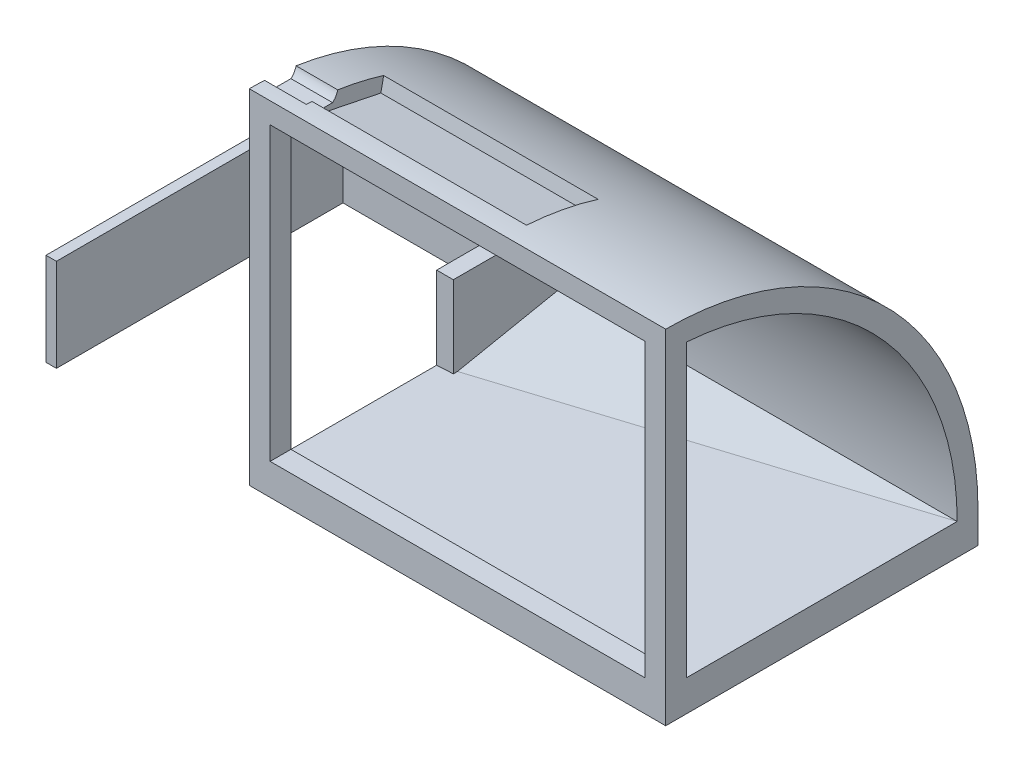
ISO-10303-21;
HEADER;
FILE_DESCRIPTION(('STEP AP214'),'2;1');
FILE_NAME('part.step','',(''),(''),'','','');
FILE_SCHEMA(('AUTOMOTIVE_DESIGN { 1 0 10303 214 1 1 1 1 }'));
ENDSEC;
DATA;
#1=APPLICATION_CONTEXT('core data for automotive mechanical design processes');
#2=APPLICATION_PROTOCOL_DEFINITION('international standard','automotive_design',2000,#1);
#3=PRODUCT_CONTEXT('',#1,'mechanical');
#4=PRODUCT('Part','Part','',(#3));
#5=PRODUCT_RELATED_PRODUCT_CATEGORY('part','',(#4));
#6=PRODUCT_DEFINITION_FORMATION('','',#4);
#7=PRODUCT_DEFINITION_CONTEXT('part definition',#1,'design');
#8=PRODUCT_DEFINITION('design','',#6,#7);
#9=PRODUCT_DEFINITION_SHAPE('','',#8);
#10=(LENGTH_UNIT() NAMED_UNIT(*) SI_UNIT(.MILLI.,.METRE.));
#11=(NAMED_UNIT(*) PLANE_ANGLE_UNIT() SI_UNIT($,.RADIAN.));
#12=(NAMED_UNIT(*) SI_UNIT($,.STERADIAN.) SOLID_ANGLE_UNIT());
#13=UNCERTAINTY_MEASURE_WITH_UNIT(LENGTH_MEASURE(1.E-05),#10,'distance_accuracy_value','');
#14=(GEOMETRIC_REPRESENTATION_CONTEXT(3) GLOBAL_UNCERTAINTY_ASSIGNED_CONTEXT((#13)) GLOBAL_UNIT_ASSIGNED_CONTEXT((#10,
#11,#12)) REPRESENTATION_CONTEXT('',''));
#15=CARTESIAN_POINT('',(0.,0.,0.));
#16=DIRECTION('',(0.,0.,1.));
#17=DIRECTION('',(1.,0.,0.));
#18=AXIS2_PLACEMENT_3D('',#15,#16,#17);
#19=CARTESIAN_POINT('',(-100.,0.,75.));
#20=DIRECTION('',(-1.,0.,0.));
#21=DIRECTION('',(0.,0.,1.));
#22=AXIS2_PLACEMENT_3D('',#19,#20,#21);
#23=CYLINDRICAL_SURFACE('',#22,140.);
#24=CARTESIAN_POINT('',(-195.,0.,75.));
#25=DIRECTION('',(-1.,0.,0.));
#26=DIRECTION('',(0.,0.,1.));
#27=AXIS2_PLACEMENT_3D('',#24,#25,#26);
#28=CIRCLE('',#27,140.);
#29=CARTESIAN_POINT('',(-195.,29.5585297831051,-61.8440474301359));
#30=VERTEX_POINT('',#29);
#31=CARTESIAN_POINT('',(-195.,0.,-65.));
#32=VERTEX_POINT('',#31);
#33=EDGE_CURVE('E434',#30,#32,#28,.T.);
#34=ORIENTED_EDGE('',*,*,#33,.T.);
#35=DIRECTION('',(1.,0.,0.));
#36=VECTOR('',#35,1.);
#37=CARTESIAN_POINT('',(-200.,0.,-65.));
#38=LINE('',#37,#36);
#39=CARTESIAN_POINT('',(-100.,0.,-65.));
#40=VERTEX_POINT('',#39);
#41=EDGE_CURVE('E215',#32,#40,#38,.T.);
#42=ORIENTED_EDGE('',*,*,#41,.T.);
#43=CARTESIAN_POINT('',(-100.,0.,75.));
#44=DIRECTION('',(-1.,0.,0.));
#45=DIRECTION('',(0.,0.,1.));
#46=AXIS2_PLACEMENT_3D('',#43,#44,#45);
#47=CIRCLE('',#46,140.);
#48=CARTESIAN_POINT('',(-100.,29.5585297831051,-61.8440474301359));
#49=VERTEX_POINT('',#48);
#50=EDGE_CURVE('E466',#49,#40,#47,.T.);
#51=ORIENTED_EDGE('',*,*,#50,.F.);
#52=DIRECTION('',(1.,0.,0.));
#53=VECTOR('',#52,1.);
#54=CARTESIAN_POINT('',(-200.,29.5585297831051,-61.8440474301359));
#55=LINE('',#54,#53);
#56=EDGE_CURVE('E230',#30,#49,#55,.T.);
#57=ORIENTED_EDGE('',*,*,#56,.F.);
#58=EDGE_LOOP('',(#34,#42,#51,#57));
#59=FACE_BOUND('',#58,.T.);
#60=ADVANCED_FACE('F211',(#59),#23,.F.);
#61=CARTESIAN_POINT('',(-200.,0.,-65.));
#62=DIRECTION('',(0.,0.,1.));
#63=DIRECTION('',(1.,0.,0.));
#64=AXIS2_PLACEMENT_3D('',#61,#62,#63);
#65=PLANE('',#64);
#66=ORIENTED_EDGE('',*,*,#41,.F.);
#67=DIRECTION('',(0.,-1.,0.));
#68=VECTOR('',#67,1.);
#69=CARTESIAN_POINT('',(-195.,0.,-65.));
#70=LINE('',#69,#68);
#71=CARTESIAN_POINT('',(-195.,-15.,-65.));
#72=VERTEX_POINT('',#71);
#73=EDGE_CURVE('E238',#32,#72,#70,.T.);
#74=ORIENTED_EDGE('',*,*,#73,.T.);
#75=DIRECTION('',(1.,0.,0.));
#76=VECTOR('',#75,1.);
#77=CARTESIAN_POINT('',(-200.,-15.,-65.));
#78=LINE('',#77,#76);
#79=CARTESIAN_POINT('',(-100.,-15.,-65.));
#80=VERTEX_POINT('',#79);
#81=EDGE_CURVE('E430',#72,#80,#78,.T.);
#82=ORIENTED_EDGE('',*,*,#81,.T.);
#83=DIRECTION('',(0.,-1.,0.));
#84=VECTOR('',#83,1.);
#85=CARTESIAN_POINT('',(-100.,0.,-65.));
#86=LINE('',#85,#84);
#87=EDGE_CURVE('E474',#40,#80,#86,.T.);
#88=ORIENTED_EDGE('',*,*,#87,.F.);
#89=EDGE_LOOP('',(#66,#74,#82,#88));
#90=FACE_BOUND('',#89,.T.);
#91=ADVANCED_FACE('F553',(#90),#65,.T.);
#92=CARTESIAN_POINT('',(-92.,0.,75.));
#93=DIRECTION('',(-1.,0.,0.));
#94=DIRECTION('',(0.,0.,1.));
#95=AXIS2_PLACEMENT_3D('',#92,#93,#94);
#96=CIRCLE('',#95,140.);
#97=CARTESIAN_POINT('',(-92.,29.5585297831051,-61.8440474301359));
#98=VERTEX_POINT('',#97);
#99=CARTESIAN_POINT('',(-92.,0.,-65.));
#100=VERTEX_POINT('',#99);
#101=EDGE_CURVE('E449',#98,#100,#96,.T.);
#102=ORIENTED_EDGE('',*,*,#101,.T.);
#103=CARTESIAN_POINT('',(-92.,0.,-65.));
#104=DIRECTION('',(1.,0.,0.));
#105=VECTOR('',#104,1.);
#106=LINE('',#103,#105);
#107=CARTESIAN_POINT('',(100.,0.,-65.));
#108=VERTEX_POINT('',#107);
#109=EDGE_CURVE('E576',#100,#108,#106,.T.);
#110=ORIENTED_EDGE('',*,*,#109,.T.);
#111=CARTESIAN_POINT('',(100.,0.,75.));
#112=DIRECTION('',(-1.,0.,0.));
#113=DIRECTION('',(0.,0.,1.));
#114=AXIS2_PLACEMENT_3D('',#111,#112,#113);
#115=CIRCLE('',#114,140.);
#116=CARTESIAN_POINT('',(100.,139.642400437689,65.));
#117=VERTEX_POINT('',#116);
#118=EDGE_CURVE('E723',#117,#108,#115,.T.);
#119=ORIENTED_EDGE('',*,*,#118,.F.);
#120=DIRECTION('',(-1.,0.,0.));
#121=VECTOR('',#120,1.);
#122=CARTESIAN_POINT('',(-100.,139.642400437689,65.));
#123=LINE('',#122,#121);
#124=CARTESIAN_POINT('',(90.,139.642400437689,65.));
#125=VERTEX_POINT('',#124);
#126=EDGE_CURVE('E682',#117,#125,#123,.T.);
#127=ORIENTED_EDGE('',*,*,#126,.T.);
#128=CARTESIAN_POINT('',(90.,0.,75.));
#129=DIRECTION('',(-1.,0.,0.));
#130=DIRECTION('',(0.,0.,1.));
#131=AXIS2_PLACEMENT_3D('',#128,#129,#130);
#132=CIRCLE('',#131,140.);
#133=CARTESIAN_POINT('',(90.,140.,75.0000000000005));
#134=VERTEX_POINT('',#133);
#135=EDGE_CURVE('E679',#134,#125,#132,.T.);
#136=ORIENTED_EDGE('',*,*,#135,.F.);
#137=DIRECTION('',(1.,0.,0.));
#138=VECTOR('',#137,1.);
#139=CARTESIAN_POINT('',(0.,140.,75.0000000000005));
#140=LINE('',#139,#138);
#141=CARTESIAN_POINT('',(-90.,140.,75.0000000000005));
#142=VERTEX_POINT('',#141);
#143=EDGE_CURVE('E705',#142,#134,#140,.T.);
#144=ORIENTED_EDGE('',*,*,#143,.F.);
#145=CARTESIAN_POINT('',(-90.,0.,75.));
#146=DIRECTION('',(-1.,0.,0.));
#147=DIRECTION('',(0.,0.,1.));
#148=AXIS2_PLACEMENT_3D('',#145,#146,#147);
#149=CIRCLE('',#148,140.);
#150=CARTESIAN_POINT('',(-90.,139.642400437689,65.0000000000001));
#151=VERTEX_POINT('',#150);
#152=EDGE_CURVE('E696',#142,#151,#149,.T.);
#153=ORIENTED_EDGE('',*,*,#152,.T.);
#154=DIRECTION('',(-1.,0.,0.));
#155=VECTOR('',#154,1.);
#156=CARTESIAN_POINT('',(-100.,139.642400437689,65.0000000000001));
#157=LINE('',#156,#155);
#158=CARTESIAN_POINT('',(-100.,139.642400437689,65.0000000000001));
#159=VERTEX_POINT('',#158);
#160=EDGE_CURVE('E701',#159,#151,#157,.F.);
#161=ORIENTED_EDGE('',*,*,#160,.F.);
#162=CARTESIAN_POINT('',(-100.,0.,75.));
#163=DIRECTION('',(-1.,0.,0.));
#164=DIRECTION('',(0.,0.,1.));
#165=AXIS2_PLACEMENT_3D('',#162,#163,#164);
#166=CIRCLE('',#165,140.);
#167=EDGE_CURVE('E713',#159,#49,#166,.T.);
#168=ORIENTED_EDGE('',*,*,#167,.T.);
#169=DIRECTION('',(-1.,0.,0.));
#170=VECTOR('',#169,1.);
#171=CARTESIAN_POINT('',(-92.,29.5585297831051,-61.8440474301359));
#172=LINE('',#171,#170);
#173=EDGE_CURVE('E461',#98,#49,#172,.T.);
#174=ORIENTED_EDGE('',*,*,#173,.F.);
#175=EDGE_LOOP('',(#102,#110,#119,#127,#136,#144,#153,#161,#168,#174));
#176=FACE_BOUND('',#175,.T.);
#177=ADVANCED_FACE('F554',(#176),#23,.F.);
#178=CARTESIAN_POINT('',(-100.,0.,-65.));
#179=DIRECTION('',(0.,-0.98058067569092,-0.196116135138184));
#180=DIRECTION('',(1.,0.,0.));
#181=AXIS2_PLACEMENT_3D('',#178,#179,#180);
#182=PLANE('',#181);
#183=DIRECTION('',(0.,-0.196116135138184,0.98058067569092));
#184=VECTOR('',#183,1.);
#185=CARTESIAN_POINT('',(-92.,-12.5,-2.49999999999998));
#186=LINE('',#185,#184);
#187=CARTESIAN_POINT('',(-92.,-9.60000000000001,-16.9999999999999));
#188=VERTEX_POINT('',#187);
#189=EDGE_CURVE('E456',#100,#188,#186,.T.);
#190=ORIENTED_EDGE('',*,*,#189,.T.);
#191=DIRECTION('',(-0.969003166223018,-0.048450158311151,0.242250791555755));
#192=VECTOR('',#191,1.);
#193=CARTESIAN_POINT('',(0.,-5.,-40.));
#194=LINE('',#193,#192);
#195=EDGE_CURVE('E509',#108,#188,#194,.T.);
#196=ORIENTED_EDGE('',*,*,#195,.F.);
#197=ORIENTED_EDGE('',*,*,#109,.F.);
#198=EDGE_LOOP('',(#190,#196,#197));
#199=FACE_BOUND('',#198,.T.);
#200=ADVANCED_FACE('F594',(#199),#182,.F.);
#201=CARTESIAN_POINT('',(-100.,0.,75.));
#202=DIRECTION('',(-1.,0.,0.));
#203=DIRECTION('',(0.,0.,1.));
#204=AXIS2_PLACEMENT_3D('',#201,#202,#203);
#205=CYLINDRICAL_SURFACE('',#204,150.);
#206=DIRECTION('',(-1.,0.,0.));
#207=VECTOR('',#206,1.);
#208=CARTESIAN_POINT('',(-90.,148.308101078321,52.5343116165472));
#209=LINE('',#208,#207);
#210=CARTESIAN_POINT('',(-80.,148.308101078321,52.5343116165472));
#211=VERTEX_POINT('',#210);
#212=CARTESIAN_POINT('',(-100.,148.308101078321,52.5343116165472));
#213=VERTEX_POINT('',#212);
#214=EDGE_CURVE('E662',#211,#213,#209,.T.);
#215=ORIENTED_EDGE('',*,*,#214,.F.);
#216=CARTESIAN_POINT('',(-80.,0.,75.));
#217=DIRECTION('',(-1.,0.,0.));
#218=DIRECTION('',(0.,0.,1.));
#219=AXIS2_PLACEMENT_3D('',#216,#217,#218);
#220=CIRCLE('',#219,150.);
#221=CARTESIAN_POINT('',(-80.,143.232691283447,30.4534384301028));
#222=VERTEX_POINT('',#221);
#223=EDGE_CURVE('E746',#222,#211,#220,.F.);
#224=ORIENTED_EDGE('',*,*,#223,.F.);
#225=DIRECTION('',(-1.,0.,0.));
#226=VECTOR('',#225,1.);
#227=CARTESIAN_POINT('',(-100.,143.232691283447,30.4534384301028));
#228=LINE('',#227,#226);
#229=CARTESIAN_POINT('',(23.,143.232691283447,30.4534384301028));
#230=VERTEX_POINT('',#229);
#231=EDGE_CURVE('E650',#222,#230,#228,.F.);
#232=ORIENTED_EDGE('',*,*,#231,.T.);
#233=CARTESIAN_POINT('',(23.,0.,75.));
#234=DIRECTION('',(-1.,0.,0.));
#235=DIRECTION('',(0.,0.,1.));
#236=AXIS2_PLACEMENT_3D('',#233,#234,#235);
#237=CIRCLE('',#236,150.);
#238=CARTESIAN_POINT('',(23.,149.657131648265,64.8637804476289));
#239=VERTEX_POINT('',#238);
#240=EDGE_CURVE('E759',#230,#239,#237,.F.);
#241=ORIENTED_EDGE('',*,*,#240,.T.);
#242=DIRECTION('',(-1.,0.,0.));
#243=VECTOR('',#242,1.);
#244=CARTESIAN_POINT('',(-100.,149.657131648265,64.8637804476289));
#245=LINE('',#244,#243);
#246=CARTESIAN_POINT('',(-80.,149.657131648265,64.8637804476289));
#247=VERTEX_POINT('',#246);
#248=EDGE_CURVE('E756',#247,#239,#245,.F.);
#249=ORIENTED_EDGE('',*,*,#248,.F.);
#250=CARTESIAN_POINT('',(-80.,0.,75.));
#251=DIRECTION('',(-1.,0.,0.));
#252=DIRECTION('',(0.,0.,1.));
#253=AXIS2_PLACEMENT_3D('',#250,#251,#252);
#254=CIRCLE('',#253,150.);
#255=CARTESIAN_POINT('',(-80.,149.819958162603,67.6528824593605));
#256=VERTEX_POINT('',#255);
#257=EDGE_CURVE('E655',#247,#256,#254,.F.);
#258=ORIENTED_EDGE('',*,*,#257,.T.);
#259=DIRECTION('',(-1.,0.,0.));
#260=VECTOR('',#259,1.);
#261=CARTESIAN_POINT('',(-90.,149.819958162603,67.6528824593605));
#262=LINE('',#261,#260);
#263=CARTESIAN_POINT('',(-100.,149.819958162603,67.6528824593605));
#264=VERTEX_POINT('',#263);
#265=EDGE_CURVE('E852',#264,#256,#262,.F.);
#266=ORIENTED_EDGE('',*,*,#265,.F.);
#267=CARTESIAN_POINT('',(-100.,0.,75.));
#268=DIRECTION('',(-1.,0.,0.));
#269=DIRECTION('',(0.,0.,1.));
#270=AXIS2_PLACEMENT_3D('',#267,#268,#269);
#271=CIRCLE('',#270,150.);
#272=CARTESIAN_POINT('',(-100.,150.,75.0000000000005));
#273=VERTEX_POINT('',#272);
#274=EDGE_CURVE('E714',#273,#264,#271,.T.);
#275=ORIENTED_EDGE('',*,*,#274,.F.);
#276=DIRECTION('',(1.,0.,0.));
#277=VECTOR('',#276,1.);
#278=CARTESIAN_POINT('',(0.,150.,75.0000000000005));
#279=LINE('',#278,#277);
#280=CARTESIAN_POINT('',(100.,150.,75.0000000000005));
#281=VERTEX_POINT('',#280);
#282=EDGE_CURVE('E709',#273,#281,#279,.T.);
#283=ORIENTED_EDGE('',*,*,#282,.T.);
#284=CARTESIAN_POINT('',(100.,0.,75.));
#285=DIRECTION('',(-1.,0.,0.));
#286=DIRECTION('',(0.,0.,1.));
#287=AXIS2_PLACEMENT_3D('',#284,#285,#286);
#288=CIRCLE('',#287,150.);
#289=CARTESIAN_POINT('',(100.,0.,-75.));
#290=VERTEX_POINT('',#289);
#291=EDGE_CURVE('E718',#281,#290,#288,.T.);
#292=ORIENTED_EDGE('',*,*,#291,.T.);
#293=DIRECTION('',(1.,0.,0.));
#294=VECTOR('',#293,1.);
#295=CARTESIAN_POINT('',(0.,0.,-75.));
#296=LINE('',#295,#294);
#297=CARTESIAN_POINT('',(-200.,0.,-75.));
#298=VERTEX_POINT('',#297);
#299=EDGE_CURVE('E516',#298,#290,#296,.T.);
#300=ORIENTED_EDGE('',*,*,#299,.F.);
#301=CARTESIAN_POINT('',(-200.,0.,75.));
#302=DIRECTION('',(-1.,0.,0.));
#303=DIRECTION('',(0.,0.,1.));
#304=AXIS2_PLACEMENT_3D('',#301,#302,#303);
#305=CIRCLE('',#304,150.);
#306=CARTESIAN_POINT('',(-200.,29.5585297831051,-72.0588090427136));
#307=VERTEX_POINT('',#306);
#308=EDGE_CURVE('E473',#307,#298,#305,.T.);
#309=ORIENTED_EDGE('',*,*,#308,.F.);
#310=DIRECTION('',(1.,0.,0.));
#311=VECTOR('',#310,1.);
#312=CARTESIAN_POINT('',(-200.,29.5585297831051,-72.0588090427136));
#313=LINE('',#312,#311);
#314=CARTESIAN_POINT('',(-100.,29.5585297831051,-72.0588090427136));
#315=VERTEX_POINT('',#314);
#316=EDGE_CURVE('E494',#307,#315,#313,.T.);
#317=ORIENTED_EDGE('',*,*,#316,.T.);
#318=EDGE_CURVE('E719',#213,#315,#271,.T.);
#319=ORIENTED_EDGE('',*,*,#318,.F.);
#320=EDGE_LOOP('',(#215,#224,#232,#241,#249,#258,#266,#275,#283,#292,#300,#309,#317,#319));
#321=FACE_BOUND('',#320,.T.);
#322=ADVANCED_FACE('F555',(#321),#205,.T.);
#323=CARTESIAN_POINT('',(0.,0.,0.));
#324=DIRECTION('',(0.,1.,0.));
#325=DIRECTION('',(0.,0.,1.));
#326=AXIS2_PLACEMENT_3D('',#323,#324,#325);
#327=PLANE('',#326);
#328=DIRECTION('',(1.,0.,0.));
#329=VECTOR('',#328,1.);
#330=CARTESIAN_POINT('',(100.,0.,65.));
#331=LINE('',#330,#329);
#332=CARTESIAN_POINT('',(-90.,0.,65.0000000000001));
#333=VERTEX_POINT('',#332);
#334=CARTESIAN_POINT('',(90.,0.,65.));
#335=VERTEX_POINT('',#334);
#336=EDGE_CURVE('E497',#333,#335,#331,.T.);
#337=ORIENTED_EDGE('',*,*,#336,.F.);
#338=DIRECTION('',(0.,0.,-1.));
#339=VECTOR('',#338,1.);
#340=CARTESIAN_POINT('',(-90.0000000000001,0.,1.24900090270331E-13));
#341=LINE('',#340,#339);
#342=CARTESIAN_POINT('',(-90.,0.,75.));
#343=VERTEX_POINT('',#342);
#344=EDGE_CURVE('E695',#343,#333,#341,.T.);
#345=ORIENTED_EDGE('',*,*,#344,.F.);
#346=DIRECTION('',(1.,0.,0.));
#347=VECTOR('',#346,1.);
#348=CARTESIAN_POINT('',(0.,0.,75.));
#349=LINE('',#348,#347);
#350=CARTESIAN_POINT('',(90.,0.,75.));
#351=VERTEX_POINT('',#350);
#352=EDGE_CURVE('E517',#343,#351,#349,.T.);
#353=ORIENTED_EDGE('',*,*,#352,.T.);
#354=DIRECTION('',(0.,0.,-1.));
#355=VECTOR('',#354,1.);
#356=CARTESIAN_POINT('',(89.9999999999999,0.,-1.2490009027033E-13));
#357=LINE('',#356,#355);
#358=EDGE_CURVE('E676',#351,#335,#357,.T.);
#359=ORIENTED_EDGE('',*,*,#358,.T.);
#360=EDGE_LOOP('',(#337,#345,#353,#359));
#361=FACE_BOUND('',#360,.T.);
#362=ADVANCED_FACE('F928',(#361),#327,.T.);
#363=CARTESIAN_POINT('',(100.,-15.,0.));
#364=DIRECTION('',(-1.,0.,0.));
#365=DIRECTION('',(0.,0.,1.));
#366=AXIS2_PLACEMENT_3D('',#363,#364,#365);
#367=PLANE('',#366);
#368=ORIENTED_EDGE('',*,*,#291,.F.);
#369=DIRECTION('',(0.,1.,0.));
#370=VECTOR('',#369,1.);
#371=CARTESIAN_POINT('',(100.,-15.,75.));
#372=LINE('',#371,#370);
#373=CARTESIAN_POINT('',(100.,-15.,75.));
#374=VERTEX_POINT('',#373);
#375=EDGE_CURVE('E749',#374,#281,#372,.T.);
#376=ORIENTED_EDGE('',*,*,#375,.F.);
#377=DIRECTION('',(0.,0.,1.));
#378=VECTOR('',#377,1.);
#379=CARTESIAN_POINT('',(100.,-15.,0.));
#380=LINE('',#379,#378);
#381=CARTESIAN_POINT('',(100.,-15.,-75.));
#382=VERTEX_POINT('',#381);
#383=EDGE_CURVE('E727',#382,#374,#380,.T.);
#384=ORIENTED_EDGE('',*,*,#383,.F.);
#385=DIRECTION('',(0.,1.,0.));
#386=VECTOR('',#385,1.);
#387=CARTESIAN_POINT('',(100.,-15.,-75.));
#388=LINE('',#387,#386);
#389=EDGE_CURVE('E737',#382,#290,#388,.T.);
#390=ORIENTED_EDGE('',*,*,#389,.T.);
#391=EDGE_LOOP('',(#368,#376,#384,#390));
#392=FACE_BOUND('',#391,.T.);
#393=DIRECTION('',(0.,0.,1.));
#394=VECTOR('',#393,1.);
#395=CARTESIAN_POINT('',(100.,0.,0.));
#396=LINE('',#395,#394);
#397=CARTESIAN_POINT('',(100.,0.,65.));
#398=VERTEX_POINT('',#397);
#399=EDGE_CURVE('E512',#108,#398,#396,.T.);
#400=ORIENTED_EDGE('',*,*,#399,.T.);
#401=DIRECTION('',(0.,-1.,0.));
#402=VECTOR('',#401,1.);
#403=CARTESIAN_POINT('',(100.,150.001,65.));
#404=LINE('',#403,#402);
#405=EDGE_CURVE('E687',#117,#398,#404,.T.);
#406=ORIENTED_EDGE('',*,*,#405,.F.);
#407=ORIENTED_EDGE('',*,*,#118,.T.);
#408=EDGE_LOOP('',(#400,#406,#407));
#409=FACE_BOUND('',#408,.T.);
#410=ADVANCED_FACE('F802',(#392,#409),#367,.F.);
#411=CARTESIAN_POINT('',(-100.,-15.,0.));
#412=DIRECTION('',(-1.,0.,0.));
#413=DIRECTION('',(0.,0.,1.));
#414=AXIS2_PLACEMENT_3D('',#411,#412,#413);
#415=PLANE('',#414);
#416=DIRECTION('',(0.,0.,-1.));
#417=VECTOR('',#416,1.);
#418=CARTESIAN_POINT('',(-100.,29.5585297831051,0.));
#419=LINE('',#418,#417);
#420=EDGE_CURVE('E485',#49,#315,#419,.T.);
#421=ORIENTED_EDGE('',*,*,#420,.F.);
#422=ORIENTED_EDGE('',*,*,#167,.F.);
#423=DIRECTION('',(0.,-1.,0.));
#424=VECTOR('',#423,1.);
#425=CARTESIAN_POINT('',(-100.,150.001,65.0000000000001));
#426=LINE('',#425,#424);
#427=CARTESIAN_POINT('',(-100.,-10.,65.0000000000001));
#428=VERTEX_POINT('',#427);
#429=EDGE_CURVE('E700',#159,#428,#426,.T.);
#430=ORIENTED_EDGE('',*,*,#429,.T.);
#431=DIRECTION('',(0.,0.,1.));
#432=VECTOR('',#431,1.);
#433=CARTESIAN_POINT('',(-100.,-10.,65.0000000000001));
#434=LINE('',#433,#432);
#435=CARTESIAN_POINT('',(-100.,-10.,-14.9999999999999));
#436=VERTEX_POINT('',#435);
#437=EDGE_CURVE('E563',#436,#428,#434,.T.);
#438=ORIENTED_EDGE('',*,*,#437,.F.);
#439=DIRECTION('',(0.,1.,0.));
#440=VECTOR('',#439,1.);
#441=CARTESIAN_POINT('',(-100.,0.,-14.9999999999999));
#442=LINE('',#441,#440);
#443=CARTESIAN_POINT('',(-100.,29.5585297831051,-14.9999999999999));
#444=VERTEX_POINT('',#443);
#445=EDGE_CURVE('E450',#436,#444,#442,.T.);
#446=ORIENTED_EDGE('',*,*,#445,.T.);
#447=DIRECTION('',(0.,0.,-1.));
#448=VECTOR('',#447,1.);
#449=CARTESIAN_POINT('',(-100.,29.5585297831051,0.));
#450=LINE('',#449,#448);
#451=EDGE_CURVE('E443',#444,#49,#450,.T.);
#452=ORIENTED_EDGE('',*,*,#451,.T.);
#453=ORIENTED_EDGE('',*,*,#50,.T.);
#454=ORIENTED_EDGE('',*,*,#87,.T.);
#455=DIRECTION('',(0.,0.,1.));
#456=VECTOR('',#455,1.);
#457=CARTESIAN_POINT('',(-100.,-15.,0.));
#458=LINE('',#457,#456);
#459=CARTESIAN_POINT('',(-100.,-15.,75.));
#460=VERTEX_POINT('',#459);
#461=EDGE_CURVE('E734',#80,#460,#458,.T.);
#462=ORIENTED_EDGE('',*,*,#461,.T.);
#463=DIRECTION('',(0.,1.,0.));
#464=VECTOR('',#463,1.);
#465=CARTESIAN_POINT('',(-100.,-15.,75.));
#466=LINE('',#465,#464);
#467=EDGE_CURVE('E740',#460,#273,#466,.T.);
#468=ORIENTED_EDGE('',*,*,#467,.T.);
#469=ORIENTED_EDGE('',*,*,#274,.T.);
#470=CARTESIAN_POINT('',(-100.,150.,60.0000000000001));
#471=DIRECTION('',(-1.,0.,0.));
#472=DIRECTION('',(0.,0.,1.));
#473=AXIS2_PLACEMENT_3D('',#470,#471,#472);
#474=CIRCLE('',#473,7.655);
#475=CARTESIAN_POINT('',(-100.,144.203533403874,65.0000000000001));
#476=VERTEX_POINT('',#475);
#477=EDGE_CURVE('E827',#476,#264,#474,.T.);
#478=ORIENTED_EDGE('',*,*,#477,.F.);
#479=DIRECTION('',(0.,0.,1.));
#480=VECTOR('',#479,1.);
#481=CARTESIAN_POINT('',(-100.,144.203533403874,0.));
#482=LINE('',#481,#480);
#483=CARTESIAN_POINT('',(-100.,144.203533403874,55.0000000000001));
#484=VERTEX_POINT('',#483);
#485=EDGE_CURVE('E834',#484,#476,#482,.T.);
#486=ORIENTED_EDGE('',*,*,#485,.F.);
#487=EDGE_CURVE('E825',#213,#484,#474,.T.);
#488=ORIENTED_EDGE('',*,*,#487,.F.);
#489=ORIENTED_EDGE('',*,*,#318,.T.);
#490=EDGE_LOOP('',(#421,#422,#430,#438,#446,#452,#453,#454,#462,#468,#469,#478,#486,#488,#489));
#491=FACE_BOUND('',#490,.T.);
#492=ADVANCED_FACE('F819',(#491),#415,.T.);
#493=CARTESIAN_POINT('',(0.,-15.,75.));
#494=DIRECTION('',(0.,0.,1.));
#495=DIRECTION('',(1.,0.,0.));
#496=AXIS2_PLACEMENT_3D('',#493,#494,#495);
#497=PLANE('',#496);
#498=ORIENTED_EDGE('',*,*,#375,.T.);
#499=ORIENTED_EDGE('',*,*,#282,.F.);
#500=ORIENTED_EDGE('',*,*,#467,.F.);
#501=DIRECTION('',(1.,0.,0.));
#502=VECTOR('',#501,1.);
#503=CARTESIAN_POINT('',(0.,-15.,75.));
#504=LINE('',#503,#502);
#505=EDGE_CURVE('E724',#460,#374,#504,.T.);
#506=ORIENTED_EDGE('',*,*,#505,.T.);
#507=EDGE_LOOP('',(#498,#499,#500,#506));
#508=FACE_BOUND('',#507,.T.);
#509=ORIENTED_EDGE('',*,*,#352,.F.);
#510=DIRECTION('',(0.,-1.,0.));
#511=VECTOR('',#510,1.);
#512=CARTESIAN_POINT('',(-90.,150.001,75.));
#513=LINE('',#512,#511);
#514=EDGE_CURVE('E691',#142,#343,#513,.T.);
#515=ORIENTED_EDGE('',*,*,#514,.F.);
#516=ORIENTED_EDGE('',*,*,#143,.T.);
#517=DIRECTION('',(0.,-1.,0.));
#518=VECTOR('',#517,1.);
#519=CARTESIAN_POINT('',(90.,150.001,75.));
#520=LINE('',#519,#518);
#521=EDGE_CURVE('E683',#134,#351,#520,.T.);
#522=ORIENTED_EDGE('',*,*,#521,.T.);
#523=EDGE_LOOP('',(#509,#515,#516,#522));
#524=FACE_BOUND('',#523,.T.);
#525=ADVANCED_FACE('F213',(#508,#524),#497,.T.);
#526=CARTESIAN_POINT('',(0.,-15.,0.));
#527=DIRECTION('',(0.,1.,0.));
#528=DIRECTION('',(0.,0.,1.));
#529=AXIS2_PLACEMENT_3D('',#526,#527,#528);
#530=PLANE('',#529);
#531=ORIENTED_EDGE('',*,*,#505,.F.);
#532=ORIENTED_EDGE('',*,*,#461,.F.);
#533=ORIENTED_EDGE('',*,*,#81,.F.);
#534=DIRECTION('',(0.,0.,1.));
#535=VECTOR('',#534,1.);
#536=CARTESIAN_POINT('',(-195.,-15.,-65.));
#537=LINE('',#536,#535);
#538=CARTESIAN_POINT('',(-195.,-15.,72.6445333836523));
#539=VERTEX_POINT('',#538);
#540=EDGE_CURVE('E409',#72,#539,#537,.T.);
#541=ORIENTED_EDGE('',*,*,#540,.T.);
#542=DIRECTION('',(-1.,0.,0.));
#543=VECTOR('',#542,1.);
#544=CARTESIAN_POINT('',(-195.,-15.,72.6445333836523));
#545=LINE('',#544,#543);
#546=CARTESIAN_POINT('',(-200.,-15.,72.6445333836523));
#547=VERTEX_POINT('',#546);
#548=EDGE_CURVE('E418',#539,#547,#545,.T.);
#549=ORIENTED_EDGE('',*,*,#548,.T.);
#550=DIRECTION('',(0.,0.,-1.));
#551=VECTOR('',#550,1.);
#552=CARTESIAN_POINT('',(-200.,-15.,0.));
#553=LINE('',#552,#551);
#554=CARTESIAN_POINT('',(-200.,-15.,-75.));
#555=VERTEX_POINT('',#554);
#556=EDGE_CURVE('E482',#547,#555,#553,.T.);
#557=ORIENTED_EDGE('',*,*,#556,.T.);
#558=DIRECTION('',(1.,0.,0.));
#559=VECTOR('',#558,1.);
#560=CARTESIAN_POINT('',(0.,-15.,-75.));
#561=LINE('',#560,#559);
#562=EDGE_CURVE('E731',#555,#382,#561,.T.);
#563=ORIENTED_EDGE('',*,*,#562,.T.);
#564=ORIENTED_EDGE('',*,*,#383,.T.);
#565=EDGE_LOOP('',(#531,#532,#533,#541,#549,#557,#563,#564));
#566=FACE_BOUND('',#565,.T.);
#567=ADVANCED_FACE('F428',(#566),#530,.F.);
#568=CARTESIAN_POINT('',(0.,-15.,-75.));
#569=DIRECTION('',(0.,0.,1.));
#570=DIRECTION('',(1.,0.,0.));
#571=AXIS2_PLACEMENT_3D('',#568,#569,#570);
#572=PLANE('',#571);
#573=ORIENTED_EDGE('',*,*,#299,.T.);
#574=ORIENTED_EDGE('',*,*,#389,.F.);
#575=ORIENTED_EDGE('',*,*,#562,.F.);
#576=DIRECTION('',(0.,1.,0.));
#577=VECTOR('',#576,1.);
#578=CARTESIAN_POINT('',(-200.,0.,-75.));
#579=LINE('',#578,#577);
#580=EDGE_CURVE('E478',#555,#298,#579,.T.);
#581=ORIENTED_EDGE('',*,*,#580,.T.);
#582=EDGE_LOOP('',(#573,#574,#575,#581));
#583=FACE_BOUND('',#582,.T.);
#584=ADVANCED_FACE('F548',(#583),#572,.F.);
#585=CARTESIAN_POINT('',(-90.0000000000001,150.001,1.24900090270331E-13));
#586=DIRECTION('',(-1.,0.,0.));
#587=DIRECTION('',(0.,0.,1.));
#588=AXIS2_PLACEMENT_3D('',#585,#586,#587);
#589=PLANE('',#588);
#590=ORIENTED_EDGE('',*,*,#152,.F.);
#591=ORIENTED_EDGE('',*,*,#514,.T.);
#592=ORIENTED_EDGE('',*,*,#344,.T.);
#593=DIRECTION('',(0.,-1.,0.));
#594=VECTOR('',#593,1.);
#595=CARTESIAN_POINT('',(-90.,150.001,65.0000000000001));
#596=LINE('',#595,#594);
#597=EDGE_CURVE('E704',#151,#333,#596,.T.);
#598=ORIENTED_EDGE('',*,*,#597,.F.);
#599=EDGE_LOOP('',(#590,#591,#592,#598));
#600=FACE_BOUND('',#599,.T.);
#601=ADVANCED_FACE('F544',(#600),#589,.F.);
#602=CARTESIAN_POINT('',(0.,150.001,65.0000000000001));
#603=DIRECTION('',(0.,0.,-1.));
#604=DIRECTION('',(-1.,0.,0.));
#605=AXIS2_PLACEMENT_3D('',#602,#603,#604);
#606=PLANE('',#605);
#607=ORIENTED_EDGE('',*,*,#429,.F.);
#608=ORIENTED_EDGE('',*,*,#160,.T.);
#609=ORIENTED_EDGE('',*,*,#597,.T.);
#610=ORIENTED_EDGE('',*,*,#336,.T.);
#611=DIRECTION('',(0.,-1.,0.));
#612=VECTOR('',#611,1.);
#613=CARTESIAN_POINT('',(90.,150.001,65.));
#614=LINE('',#613,#612);
#615=EDGE_CURVE('E789',#125,#335,#614,.T.);
#616=ORIENTED_EDGE('',*,*,#615,.F.);
#617=ORIENTED_EDGE('',*,*,#126,.F.);
#618=ORIENTED_EDGE('',*,*,#405,.T.);
#619=DIRECTION('',(0.998752338877845,0.0499376169438922,0.));
#620=VECTOR('',#619,1.);
#621=CARTESIAN_POINT('',(0.,-5.,65.0000000000001));
#622=LINE('',#621,#620);
#623=EDGE_CURVE('E505',#428,#398,#622,.T.);
#624=ORIENTED_EDGE('',*,*,#623,.F.);
#625=EDGE_LOOP('',(#607,#608,#609,#610,#616,#617,#618,#624));
#626=FACE_BOUND('',#625,.T.);
#627=ADVANCED_FACE('F533',(#626),#606,.T.);
#628=CARTESIAN_POINT('',(89.9999999999999,150.001,-1.2490009027033E-13));
#629=DIRECTION('',(-1.,0.,0.));
#630=DIRECTION('',(0.,0.,1.));
#631=AXIS2_PLACEMENT_3D('',#628,#629,#630);
#632=PLANE('',#631);
#633=ORIENTED_EDGE('',*,*,#521,.F.);
#634=ORIENTED_EDGE('',*,*,#135,.T.);
#635=ORIENTED_EDGE('',*,*,#615,.T.);
#636=ORIENTED_EDGE('',*,*,#358,.F.);
#637=EDGE_LOOP('',(#633,#634,#635,#636));
#638=FACE_BOUND('',#637,.T.);
#639=ADVANCED_FACE('F543',(#638),#632,.T.);
#640=CARTESIAN_POINT('',(23.,18.6969384566988,91.5959179422656));
#641=DIRECTION('',(0.,0.199999999999997,0.979795897113272));
#642=DIRECTION('',(0.,-0.979795897113272,0.199999999999997));
#643=AXIS2_PLACEMENT_3D('',#640,#641,#642);
#644=PLANE('',#643);
#645=ORIENTED_EDGE('',*,*,#248,.T.);
#646=DIRECTION('',(0.,0.979795897113272,-0.199999999999997));
#647=VECTOR('',#646,1.);
#648=CARTESIAN_POINT('',(23.,18.6969384566988,91.5959179422656));
#649=LINE('',#648,#647);
#650=CARTESIAN_POINT('',(23.,143.620915338641,66.0959179422659));
#651=VERTEX_POINT('',#650);
#652=EDGE_CURVE('E665',#651,#239,#649,.T.);
#653=ORIENTED_EDGE('',*,*,#652,.F.);
#654=DIRECTION('',(-1.,0.,0.));
#655=VECTOR('',#654,1.);
#656=CARTESIAN_POINT('',(23.,143.620915338641,66.0959179422659));
#657=LINE('',#656,#655);
#658=CARTESIAN_POINT('',(-80.,143.620915338641,66.0959179422659));
#659=VERTEX_POINT('',#658);
#660=EDGE_CURVE('E673',#651,#659,#657,.T.);
#661=ORIENTED_EDGE('',*,*,#660,.T.);
#662=DIRECTION('',(0.,0.979795897113272,-0.199999999999997));
#663=VECTOR('',#662,1.);
#664=CARTESIAN_POINT('',(-80.,18.6969384566988,91.5959179422656));
#665=LINE('',#664,#663);
#666=CARTESIAN_POINT('',(-80.,145.016864380401,65.8109710373294));
#667=VERTEX_POINT('',#666);
#668=EDGE_CURVE('E668',#659,#667,#665,.T.);
#669=ORIENTED_EDGE('',*,*,#668,.T.);
#670=EDGE_CURVE('E659',#667,#247,#665,.T.);
#671=ORIENTED_EDGE('',*,*,#670,.T.);
#672=EDGE_LOOP('',(#645,#653,#661,#669,#671));
#673=FACE_BOUND('',#672,.T.);
#674=ADVANCED_FACE('F630',(#673),#644,.F.);
#675=CARTESIAN_POINT('',(23.,124.923976881942,-25.4999999999996));
#676=DIRECTION('',(0.,0.979795897113272,-0.199999999999997));
#677=DIRECTION('',(0.,0.199999999999997,0.979795897113272));
#678=AXIS2_PLACEMENT_3D('',#675,#676,#677);
#679=PLANE('',#678);
#680=DIRECTION('',(0.,-0.199999999999997,-0.979795897113272));
#681=VECTOR('',#680,1.);
#682=CARTESIAN_POINT('',(-80.,124.923976881942,-25.4999999999996));
#683=LINE('',#682,#681);
#684=CARTESIAN_POINT('',(-80.,136.620915338641,31.8030615433014));
#685=VERTEX_POINT('',#684);
#686=EDGE_CURVE('E654',#659,#685,#683,.T.);
#687=ORIENTED_EDGE('',*,*,#686,.F.);
#688=ORIENTED_EDGE('',*,*,#660,.F.);
#689=DIRECTION('',(0.,-0.199999999999997,-0.979795897113272));
#690=VECTOR('',#689,1.);
#691=CARTESIAN_POINT('',(23.,124.923976881942,-25.4999999999996));
#692=LINE('',#691,#690);
#693=CARTESIAN_POINT('',(23.,136.620915338641,31.8030615433014));
#694=VERTEX_POINT('',#693);
#695=EDGE_CURVE('E858',#651,#694,#692,.T.);
#696=ORIENTED_EDGE('',*,*,#695,.T.);
#697=DIRECTION('',(-1.,0.,0.));
#698=VECTOR('',#697,1.);
#699=CARTESIAN_POINT('',(23.,136.620915338641,31.8030615433014));
#700=LINE('',#699,#698);
#701=EDGE_CURVE('E647',#694,#685,#700,.T.);
#702=ORIENTED_EDGE('',*,*,#701,.T.);
#703=EDGE_LOOP('',(#687,#688,#696,#702));
#704=FACE_BOUND('',#703,.T.);
#705=ADVANCED_FACE('F633',(#704),#679,.T.);
#706=CARTESIAN_POINT('',(23.,11.696938456699,57.3030615433011));
#707=DIRECTION('',(0.,0.199999999999998,0.979795897113272));
#708=DIRECTION('',(0.,-0.979795897113272,0.199999999999998));
#709=AXIS2_PLACEMENT_3D('',#706,#707,#708);
#710=PLANE('',#709);
#711=DIRECTION('',(0.,0.979795897113272,-0.199999999999998));
#712=VECTOR('',#711,1.);
#713=CARTESIAN_POINT('',(-80.,11.696938456699,57.3030615433011));
#714=LINE('',#713,#712);
#715=EDGE_CURVE('E644',#685,#222,#714,.T.);
#716=ORIENTED_EDGE('',*,*,#715,.F.);
#717=ORIENTED_EDGE('',*,*,#701,.F.);
#718=DIRECTION('',(0.,0.979795897113272,-0.199999999999998));
#719=VECTOR('',#718,1.);
#720=CARTESIAN_POINT('',(23.,11.696938456699,57.3030615433011));
#721=LINE('',#720,#719);
#722=EDGE_CURVE('E672',#694,#230,#721,.T.);
#723=ORIENTED_EDGE('',*,*,#722,.T.);
#724=ORIENTED_EDGE('',*,*,#231,.F.);
#725=EDGE_LOOP('',(#716,#717,#723,#724));
#726=FACE_BOUND('',#725,.T.);
#727=ADVANCED_FACE('F625',(#726),#710,.T.);
#728=CARTESIAN_POINT('',(23.,0.,0.));
#729=DIRECTION('',(-1.,0.,0.));
#730=DIRECTION('',(0.,0.,1.));
#731=AXIS2_PLACEMENT_3D('',#728,#729,#730);
#732=PLANE('',#731);
#733=ORIENTED_EDGE('',*,*,#722,.F.);
#734=ORIENTED_EDGE('',*,*,#695,.F.);
#735=ORIENTED_EDGE('',*,*,#652,.T.);
#736=ORIENTED_EDGE('',*,*,#240,.F.);
#737=EDGE_LOOP('',(#733,#734,#735,#736));
#738=FACE_BOUND('',#737,.T.);
#739=ADVANCED_FACE('F621',(#738),#732,.T.);
#740=CARTESIAN_POINT('',(-80.,0.,0.));
#741=DIRECTION('',(-1.,0.,0.));
#742=DIRECTION('',(0.,0.,1.));
#743=AXIS2_PLACEMENT_3D('',#740,#741,#742);
#744=PLANE('',#743);
#745=ORIENTED_EDGE('',*,*,#223,.T.);
#746=CARTESIAN_POINT('',(-80.,150.,60.0000000000001));
#747=DIRECTION('',(-1.,0.,0.));
#748=DIRECTION('',(0.,0.,1.));
#749=AXIS2_PLACEMENT_3D('',#746,#747,#748);
#750=CIRCLE('',#749,7.655);
#751=CARTESIAN_POINT('',(-80.,144.203533403874,55.0000000000001));
#752=VERTEX_POINT('',#751);
#753=EDGE_CURVE('E837',#752,#211,#750,.F.);
#754=ORIENTED_EDGE('',*,*,#753,.F.);
#755=DIRECTION('',(0.,0.,-1.));
#756=VECTOR('',#755,1.);
#757=CARTESIAN_POINT('',(-80.,144.203533403874,0.));
#758=LINE('',#757,#756);
#759=CARTESIAN_POINT('',(-80.,144.203533403874,65.0000000000001));
#760=VERTEX_POINT('',#759);
#761=EDGE_CURVE('E849',#760,#752,#758,.T.);
#762=ORIENTED_EDGE('',*,*,#761,.F.);
#763=CARTESIAN_POINT('',(-80.,150.,60.0000000000001));
#764=DIRECTION('',(-1.,0.,0.));
#765=DIRECTION('',(0.,0.,1.));
#766=AXIS2_PLACEMENT_3D('',#763,#764,#765);
#767=CIRCLE('',#766,7.655);
#768=EDGE_CURVE('E763',#760,#667,#767,.T.);
#769=ORIENTED_EDGE('',*,*,#768,.T.);
#770=ORIENTED_EDGE('',*,*,#668,.F.);
#771=ORIENTED_EDGE('',*,*,#686,.T.);
#772=ORIENTED_EDGE('',*,*,#715,.T.);
#773=EDGE_LOOP('',(#745,#754,#762,#769,#770,#771,#772));
#774=FACE_BOUND('',#773,.T.);
#775=ADVANCED_FACE('F624',(#774),#744,.F.);
#776=CARTESIAN_POINT('',(-59.6201557025898,150.,60.0000000000001));
#777=DIRECTION('',(-1.,0.,0.));
#778=DIRECTION('',(0.,0.,1.));
#779=AXIS2_PLACEMENT_3D('',#776,#777,#778);
#780=CYLINDRICAL_SURFACE('',#779,7.655);
#781=ORIENTED_EDGE('',*,*,#214,.T.);
#782=ORIENTED_EDGE('',*,*,#487,.T.);
#783=DIRECTION('',(-1.,0.,0.));
#784=VECTOR('',#783,1.);
#785=CARTESIAN_POINT('',(-59.6201557025898,144.203533403874,55.0000000000001));
#786=LINE('',#785,#784);
#787=EDGE_CURVE('E842',#752,#484,#786,.T.);
#788=ORIENTED_EDGE('',*,*,#787,.F.);
#789=ORIENTED_EDGE('',*,*,#753,.T.);
#790=EDGE_LOOP('',(#781,#782,#788,#789));
#791=FACE_BOUND('',#790,.T.);
#792=ADVANCED_FACE('F619',(#791),#780,.F.);
#793=ORIENTED_EDGE('',*,*,#265,.T.);
#794=EDGE_CURVE('E846',#256,#667,#750,.F.);
#795=ORIENTED_EDGE('',*,*,#794,.T.);
#796=ORIENTED_EDGE('',*,*,#768,.F.);
#797=DIRECTION('',(-1.,0.,0.));
#798=VECTOR('',#797,1.);
#799=CARTESIAN_POINT('',(-59.6201557025898,144.203533403874,65.));
#800=LINE('',#799,#798);
#801=EDGE_CURVE('E843',#760,#476,#800,.T.);
#802=ORIENTED_EDGE('',*,*,#801,.T.);
#803=ORIENTED_EDGE('',*,*,#477,.T.);
#804=EDGE_LOOP('',(#793,#795,#796,#802,#803));
#805=FACE_BOUND('',#804,.T.);
#806=ADVANCED_FACE('F615',(#805),#780,.F.);
#807=CARTESIAN_POINT('',(-59.6201557025898,144.203533403874,0.));
#808=DIRECTION('',(0.,-1.,0.));
#809=DIRECTION('',(0.,0.,-1.));
#810=AXIS2_PLACEMENT_3D('',#807,#808,#809);
#811=PLANE('',#810);
#812=ORIENTED_EDGE('',*,*,#761,.T.);
#813=ORIENTED_EDGE('',*,*,#787,.T.);
#814=ORIENTED_EDGE('',*,*,#485,.T.);
#815=ORIENTED_EDGE('',*,*,#801,.F.);
#816=EDGE_LOOP('',(#812,#813,#814,#815));
#817=FACE_BOUND('',#816,.T.);
#818=ADVANCED_FACE('F611',(#817),#811,.F.);
#819=CARTESIAN_POINT('',(-80.,0.,0.));
#820=DIRECTION('',(-1.,0.,0.));
#821=DIRECTION('',(0.,0.,1.));
#822=AXIS2_PLACEMENT_3D('',#819,#820,#821);
#823=PLANE('',#822);
#824=ORIENTED_EDGE('',*,*,#670,.F.);
#825=ORIENTED_EDGE('',*,*,#794,.F.);
#826=ORIENTED_EDGE('',*,*,#257,.F.);
#827=EDGE_LOOP('',(#824,#825,#826));
#828=FACE_BOUND('',#827,.T.);
#829=ADVANCED_FACE('F607',(#828),#823,.T.);
#830=CARTESIAN_POINT('',(0.249376558603492,-4.98753117206983,0.));
#831=DIRECTION('',(-0.0499376169438922,0.998752338877845,0.));
#832=DIRECTION('',(-0.998752338877845,-0.0499376169438922,0.));
#833=AXIS2_PLACEMENT_3D('',#830,#831,#832);
#834=PLANE('',#833);
#835=DIRECTION('',(0.998752338877845,0.0499376169438922,0.));
#836=VECTOR('',#835,1.);
#837=CARTESIAN_POINT('',(0.249376558603489,-4.98753117206984,-14.9999999999999));
#838=LINE('',#837,#836);
#839=CARTESIAN_POINT('',(-92.,-9.60000000000001,-14.9999999999999));
#840=VERTEX_POINT('',#839);
#841=EDGE_CURVE('E12',#436,#840,#838,.T.);
#842=ORIENTED_EDGE('',*,*,#841,.F.);
#843=ORIENTED_EDGE('',*,*,#437,.T.);
#844=ORIENTED_EDGE('',*,*,#623,.T.);
#845=ORIENTED_EDGE('',*,*,#399,.F.);
#846=ORIENTED_EDGE('',*,*,#195,.T.);
#847=DIRECTION('',(0.,0.,1.));
#848=VECTOR('',#847,1.);
#849=CARTESIAN_POINT('',(-92.,-9.60000000000001,0.));
#850=LINE('',#849,#848);
#851=EDGE_CURVE('E222',#188,#840,#850,.T.);
#852=ORIENTED_EDGE('',*,*,#851,.T.);
#853=EDGE_LOOP('',(#842,#843,#844,#845,#846,#852));
#854=FACE_BOUND('',#853,.T.);
#855=ADVANCED_FACE('F604',(#854),#834,.T.);
#856=CARTESIAN_POINT('',(-200.,29.5585297831051,0.));
#857=DIRECTION('',(0.,-1.,0.));
#858=DIRECTION('',(0.,0.,-1.));
#859=AXIS2_PLACEMENT_3D('',#856,#857,#858);
#860=PLANE('',#859);
#861=ORIENTED_EDGE('',*,*,#420,.T.);
#862=ORIENTED_EDGE('',*,*,#316,.F.);
#863=DIRECTION('',(0.,0.,-1.));
#864=VECTOR('',#863,1.);
#865=CARTESIAN_POINT('',(-200.,29.5585297831051,0.));
#866=LINE('',#865,#864);
#867=CARTESIAN_POINT('',(-200.,29.5585297831051,72.6445333836523));
#868=VERTEX_POINT('',#867);
#869=EDGE_CURVE('E469',#868,#307,#866,.T.);
#870=ORIENTED_EDGE('',*,*,#869,.F.);
#871=DIRECTION('',(-1.,0.,0.));
#872=VECTOR('',#871,1.);
#873=CARTESIAN_POINT('',(-195.,29.5585297831051,72.6445333836523));
#874=LINE('',#873,#872);
#875=CARTESIAN_POINT('',(-195.,29.5585297831051,72.6445333836523));
#876=VERTEX_POINT('',#875);
#877=EDGE_CURVE('E425',#876,#868,#874,.T.);
#878=ORIENTED_EDGE('',*,*,#877,.F.);
#879=DIRECTION('',(0.,0.,1.));
#880=VECTOR('',#879,1.);
#881=CARTESIAN_POINT('',(-195.,29.5585297831051,-61.8440474301359));
#882=LINE('',#881,#880);
#883=EDGE_CURVE('E410',#30,#876,#882,.T.);
#884=ORIENTED_EDGE('',*,*,#883,.F.);
#885=ORIENTED_EDGE('',*,*,#56,.T.);
#886=EDGE_LOOP('',(#861,#862,#870,#878,#884,#885));
#887=FACE_BOUND('',#886,.T.);
#888=ADVANCED_FACE('F899',(#887),#860,.F.);
#889=CARTESIAN_POINT('',(-200.,0.,0.));
#890=DIRECTION('',(-1.,0.,0.));
#891=DIRECTION('',(0.,0.,1.));
#892=AXIS2_PLACEMENT_3D('',#889,#890,#891);
#893=PLANE('',#892);
#894=ORIENTED_EDGE('',*,*,#869,.T.);
#895=ORIENTED_EDGE('',*,*,#308,.T.);
#896=ORIENTED_EDGE('',*,*,#580,.F.);
#897=ORIENTED_EDGE('',*,*,#556,.F.);
#898=DIRECTION('',(0.,-1.,0.));
#899=VECTOR('',#898,1.);
#900=CARTESIAN_POINT('',(-200.,29.5585297831051,72.6445333836523));
#901=LINE('',#900,#899);
#902=EDGE_CURVE('E421',#868,#547,#901,.T.);
#903=ORIENTED_EDGE('',*,*,#902,.F.);
#904=EDGE_LOOP('',(#894,#895,#896,#897,#903));
#905=FACE_BOUND('',#904,.T.);
#906=ADVANCED_FACE('F895',(#905),#893,.T.);
#907=CARTESIAN_POINT('',(-92.,29.5585297831051,0.));
#908=DIRECTION('',(0.,1.,0.));
#909=DIRECTION('',(0.,0.,1.));
#910=AXIS2_PLACEMENT_3D('',#907,#908,#909);
#911=PLANE('',#910);
#912=ORIENTED_EDGE('',*,*,#451,.F.);
#913=DIRECTION('',(-1.,0.,0.));
#914=VECTOR('',#913,1.);
#915=CARTESIAN_POINT('',(-92.,29.5585297831051,-14.9999999999999));
#916=LINE('',#915,#914);
#917=CARTESIAN_POINT('',(-92.,29.5585297831051,-14.9999999999999));
#918=VERTEX_POINT('',#917);
#919=EDGE_CURVE('E489',#918,#444,#916,.T.);
#920=ORIENTED_EDGE('',*,*,#919,.F.);
#921=DIRECTION('',(0.,0.,-1.));
#922=VECTOR('',#921,1.);
#923=CARTESIAN_POINT('',(-92.,29.5585297831051,0.));
#924=LINE('',#923,#922);
#925=EDGE_CURVE('E445',#918,#98,#924,.T.);
#926=ORIENTED_EDGE('',*,*,#925,.T.);
#927=ORIENTED_EDGE('',*,*,#173,.T.);
#928=EDGE_LOOP('',(#912,#920,#926,#927));
#929=FACE_BOUND('',#928,.T.);
#930=ADVANCED_FACE('F1003',(#929),#911,.T.);
#931=CARTESIAN_POINT('',(-92.,0.,-14.9999999999999));
#932=DIRECTION('',(0.,0.,1.));
#933=DIRECTION('',(1.,0.,0.));
#934=AXIS2_PLACEMENT_3D('',#931,#932,#933);
#935=PLANE('',#934);
#936=ORIENTED_EDGE('',*,*,#445,.F.);
#937=ORIENTED_EDGE('',*,*,#841,.T.);
#938=DIRECTION('',(0.,1.,0.));
#939=VECTOR('',#938,1.);
#940=CARTESIAN_POINT('',(-92.,0.,-14.9999999999999));
#941=LINE('',#940,#939);
#942=EDGE_CURVE('E453',#840,#918,#941,.T.);
#943=ORIENTED_EDGE('',*,*,#942,.T.);
#944=ORIENTED_EDGE('',*,*,#919,.T.);
#945=EDGE_LOOP('',(#936,#937,#943,#944));
#946=FACE_BOUND('',#945,.T.);
#947=ADVANCED_FACE('F1006',(#946),#935,.T.);
#948=CARTESIAN_POINT('',(-92.,0.,0.));
#949=DIRECTION('',(-1.,0.,0.));
#950=DIRECTION('',(0.,0.,1.));
#951=AXIS2_PLACEMENT_3D('',#948,#949,#950);
#952=PLANE('',#951);
#953=ORIENTED_EDGE('',*,*,#851,.F.);
#954=ORIENTED_EDGE('',*,*,#189,.F.);
#955=ORIENTED_EDGE('',*,*,#101,.F.);
#956=ORIENTED_EDGE('',*,*,#925,.F.);
#957=ORIENTED_EDGE('',*,*,#942,.F.);
#958=EDGE_LOOP('',(#953,#954,#955,#956,#957));
#959=FACE_BOUND('',#958,.T.);
#960=ADVANCED_FACE('F1015',(#959),#952,.F.);
#961=CARTESIAN_POINT('',(-195.,29.5585297831051,72.6445333836523));
#962=DIRECTION('',(0.,0.,-1.));
#963=DIRECTION('',(-1.,0.,0.));
#964=AXIS2_PLACEMENT_3D('',#961,#962,#963);
#965=PLANE('',#964);
#966=ORIENTED_EDGE('',*,*,#902,.T.);
#967=ORIENTED_EDGE('',*,*,#548,.F.);
#968=DIRECTION('',(0.,-1.,0.));
#969=VECTOR('',#968,1.);
#970=CARTESIAN_POINT('',(-195.,29.5585297831051,72.6445333836523));
#971=LINE('',#970,#969);
#972=EDGE_CURVE('E404',#876,#539,#971,.T.);
#973=ORIENTED_EDGE('',*,*,#972,.F.);
#974=ORIENTED_EDGE('',*,*,#877,.T.);
#975=EDGE_LOOP('',(#966,#967,#973,#974));
#976=FACE_BOUND('',#975,.T.);
#977=ADVANCED_FACE('F419',(#976),#965,.F.);
#978=CARTESIAN_POINT('',(-195.,0.,75.));
#979=DIRECTION('',(-1.,0.,0.));
#980=DIRECTION('',(0.,0.,1.));
#981=AXIS2_PLACEMENT_3D('',#978,#979,#980);
#982=PLANE('',#981);
#983=ORIENTED_EDGE('',*,*,#33,.F.);
#984=ORIENTED_EDGE('',*,*,#883,.T.);
#985=ORIENTED_EDGE('',*,*,#972,.T.);
#986=ORIENTED_EDGE('',*,*,#540,.F.);
#987=ORIENTED_EDGE('',*,*,#73,.F.);
#988=EDGE_LOOP('',(#983,#984,#985,#986,#987));
#989=FACE_BOUND('',#988,.T.);
#990=ADVANCED_FACE('F407',(#989),#982,.F.);
#991=CLOSED_SHELL('',(#60,#91,#177,#200,#322,#362,#410,#492,#525,#567,#584,#601,#627,#639,#674,
#705,#727,#739,#775,#792,#806,#818,#829,#855,#888,#906,#930,#947,#960,#977,#990));
#992=MANIFOLD_SOLID_BREP('B2',#991);
#993=ADVANCED_BREP_SHAPE_REPRESENTATION('',(#18,#992),#14);
#994=SHAPE_DEFINITION_REPRESENTATION(#9,#993);
ENDSEC;
END-ISO-10303-21;
